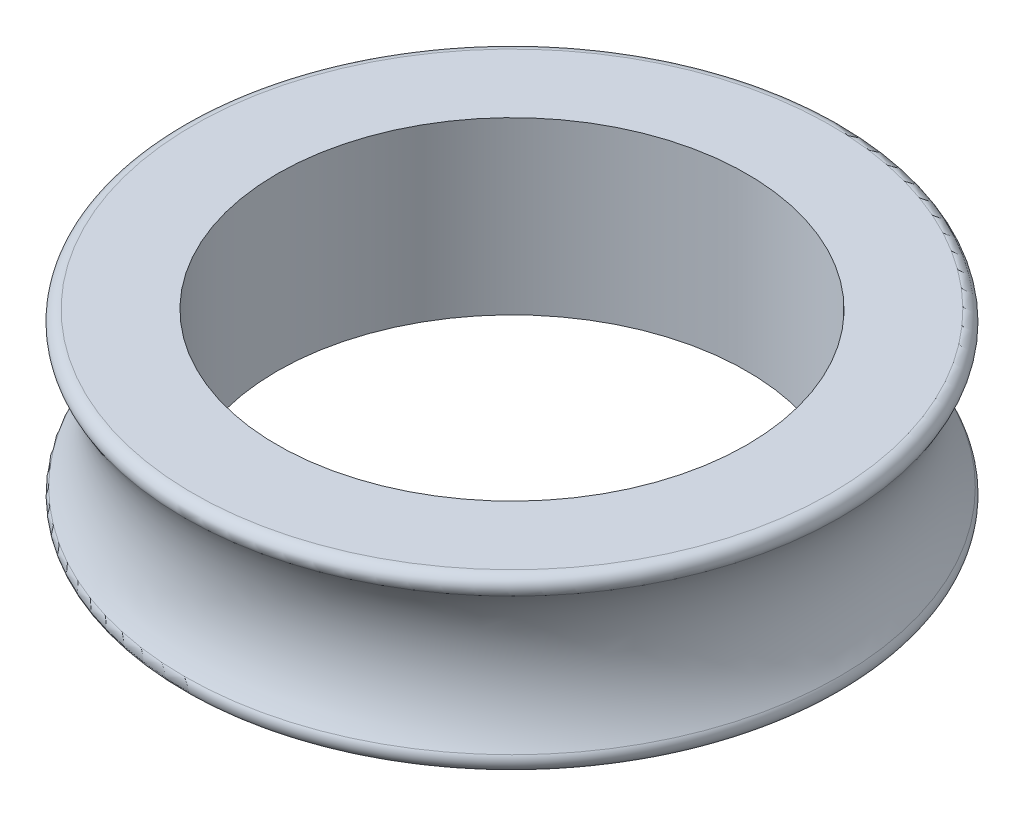
ISO-10303-21;
HEADER;
FILE_DESCRIPTION(('STEP AP214'),'2;1');
FILE_NAME('part.step','',(''),(''),'','','');
FILE_SCHEMA(('AUTOMOTIVE_DESIGN { 1 0 10303 214 1 1 1 1 }'));
ENDSEC;
DATA;
#1=APPLICATION_CONTEXT('core data for automotive mechanical design processes');
#2=APPLICATION_PROTOCOL_DEFINITION('international standard','automotive_design',2000,#1);
#3=PRODUCT_CONTEXT('',#1,'mechanical');
#4=PRODUCT('Part','Part','',(#3));
#5=PRODUCT_RELATED_PRODUCT_CATEGORY('part','',(#4));
#6=PRODUCT_DEFINITION_FORMATION('','',#4);
#7=PRODUCT_DEFINITION_CONTEXT('part definition',#1,'design');
#8=PRODUCT_DEFINITION('design','',#6,#7);
#9=PRODUCT_DEFINITION_SHAPE('','',#8);
#10=(LENGTH_UNIT() NAMED_UNIT(*) SI_UNIT(.MILLI.,.METRE.));
#11=(NAMED_UNIT(*) PLANE_ANGLE_UNIT() SI_UNIT($,.RADIAN.));
#12=(NAMED_UNIT(*) SI_UNIT($,.STERADIAN.) SOLID_ANGLE_UNIT());
#13=UNCERTAINTY_MEASURE_WITH_UNIT(LENGTH_MEASURE(1.E-05),#10,'distance_accuracy_value','');
#14=(GEOMETRIC_REPRESENTATION_CONTEXT(3) GLOBAL_UNCERTAINTY_ASSIGNED_CONTEXT((#13)) GLOBAL_UNIT_ASSIGNED_CONTEXT((#10,
#11,#12)) REPRESENTATION_CONTEXT('',''));
#15=CARTESIAN_POINT('',(0.,0.,0.));
#16=DIRECTION('',(0.,0.,1.));
#17=DIRECTION('',(1.,0.,0.));
#18=AXIS2_PLACEMENT_3D('',#15,#16,#17);
#19=CARTESIAN_POINT('',(0.,0.,0.));
#20=DIRECTION('',(0.,-1.,0.));
#21=DIRECTION('',(1.,0.,0.));
#22=AXIS2_PLACEMENT_3D('',#19,#20,#21);
#23=TOROIDAL_SURFACE('',#22,20.,5.65685424949239);
#24=CARTESIAN_POINT('',(0.,-3.21576393900432,0.));
#25=DIRECTION('',(0.,1.,0.));
#26=DIRECTION('',(-1.,0.,0.));
#27=AXIS2_PLACEMENT_3D('',#24,#25,#26);
#28=CIRCLE('',#27,15.3460917189313);
#29=CARTESIAN_POINT('',(-15.3460917189313,-3.21576393900437,0.));
#30=VERTEX_POINT('',#29);
#31=EDGE_CURVE('E45',#30,#30,#28,.T.);
#32=ORIENTED_EDGE('',*,*,#31,.T.);
#33=EDGE_LOOP('',(#32));
#34=FACE_BOUND('',#33,.T.);
#35=CARTESIAN_POINT('',(0.,3.2157639390044,0.));
#36=DIRECTION('',(0.,-1.,0.));
#37=DIRECTION('',(1.,0.,0.));
#38=AXIS2_PLACEMENT_3D('',#35,#36,#37);
#39=CIRCLE('',#38,15.3460917189314);
#40=CARTESIAN_POINT('',(15.3460917189314,3.21576393900445,0.));
#41=VERTEX_POINT('',#40);
#42=EDGE_CURVE('E50',#41,#41,#39,.T.);
#43=ORIENTED_EDGE('',*,*,#42,.T.);
#44=EDGE_LOOP('',(#43));
#45=FACE_BOUND('',#44,.T.);
#46=ADVANCED_FACE('F37',(#34,#45),#23,.F.);
#47=CARTESIAN_POINT('',(-16.,3.99999999999999,0.));
#48=DIRECTION('',(0.,-1.,0.));
#49=DIRECTION('',(1.,0.,0.));
#50=AXIS2_PLACEMENT_3D('',#47,#48,#49);
#51=PLANE('',#50);
#52=CARTESIAN_POINT('',(0.,4.00000000000005,0.));
#53=DIRECTION('',(0.,-1.,0.));
#54=DIRECTION('',(1.,0.,0.));
#55=AXIS2_PLACEMENT_3D('',#52,#53,#54);
#56=CIRCLE('',#55,14.9347404558609);
#57=CARTESIAN_POINT('',(14.9347404558609,4.0000000000001,0.));
#58=VERTEX_POINT('',#57);
#59=EDGE_CURVE('E10',#58,#58,#56,.F.);
#60=ORIENTED_EDGE('',*,*,#59,.T.);
#61=EDGE_LOOP('',(#60));
#62=FACE_BOUND('',#61,.T.);
#63=CARTESIAN_POINT('',(0.,4.,0.));
#64=DIRECTION('',(0.,-1.,0.));
#65=DIRECTION('',(1.,0.,0.));
#66=AXIS2_PLACEMENT_3D('',#63,#64,#65);
#67=CIRCLE('',#66,11.);
#68=CARTESIAN_POINT('',(11.,4.00000000000004,0.));
#69=VERTEX_POINT('',#68);
#70=EDGE_CURVE('E61',#69,#69,#67,.T.);
#71=ORIENTED_EDGE('',*,*,#70,.T.);
#72=EDGE_LOOP('',(#71));
#73=FACE_BOUND('',#72,.T.);
#74=ADVANCED_FACE('F82',(#62,#73),#51,.F.);
#75=CARTESIAN_POINT('',(3.43024899888577E-12,-1000.,0.));
#76=DIRECTION('',(0.,-1.,0.));
#77=DIRECTION('',(1.,0.,0.));
#78=AXIS2_PLACEMENT_3D('',#75,#76,#77);
#79=CYLINDRICAL_SURFACE('',#78,11.);
#80=ORIENTED_EDGE('',*,*,#70,.F.);
#81=EDGE_LOOP('',(#80));
#82=FACE_BOUND('',#81,.T.);
#83=CARTESIAN_POINT('',(0.,-4.,0.));
#84=DIRECTION('',(0.,-1.,0.));
#85=DIRECTION('',(1.,0.,0.));
#86=AXIS2_PLACEMENT_3D('',#83,#84,#85);
#87=CIRCLE('',#86,11.);
#88=CARTESIAN_POINT('',(11.,-3.99999999999997,0.));
#89=VERTEX_POINT('',#88);
#90=EDGE_CURVE('E65',#89,#89,#87,.T.);
#91=ORIENTED_EDGE('',*,*,#90,.T.);
#92=EDGE_LOOP('',(#91));
#93=FACE_BOUND('',#92,.T.);
#94=ADVANCED_FACE('F70',(#82,#93),#79,.F.);
#95=CARTESIAN_POINT('',(-11.,-3.99999999999999,0.));
#96=DIRECTION('',(0.,1.,0.));
#97=DIRECTION('',(-1.,0.,0.));
#98=AXIS2_PLACEMENT_3D('',#95,#96,#97);
#99=PLANE('',#98);
#100=CARTESIAN_POINT('',(0.,-3.99999999999996,0.));
#101=DIRECTION('',(0.,1.,0.));
#102=DIRECTION('',(-1.,0.,0.));
#103=AXIS2_PLACEMENT_3D('',#100,#101,#102);
#104=CIRCLE('',#103,14.9347404558609);
#105=CARTESIAN_POINT('',(-14.9347404558608,-4.00000000000001,0.));
#106=VERTEX_POINT('',#105);
#107=EDGE_CURVE('E55',#106,#106,#104,.F.);
#108=ORIENTED_EDGE('',*,*,#107,.T.);
#109=EDGE_LOOP('',(#108));
#110=FACE_BOUND('',#109,.T.);
#111=ORIENTED_EDGE('',*,*,#90,.F.);
#112=EDGE_LOOP('',(#111));
#113=FACE_BOUND('',#112,.T.);
#114=ADVANCED_FACE('F72',(#110,#113),#99,.F.);
#115=CARTESIAN_POINT('',(0.,-3.49999999999996,0.));
#116=DIRECTION('',(0.,-1.,0.));
#117=DIRECTION('',(1.,0.,0.));
#118=AXIS2_PLACEMENT_3D('',#115,#116,#117);
#119=TOROIDAL_SURFACE('',#118,14.9347404558609,0.5);
#120=ORIENTED_EDGE('',*,*,#31,.F.);
#121=EDGE_LOOP('',(#120));
#122=FACE_BOUND('',#121,.T.);
#123=ORIENTED_EDGE('',*,*,#107,.F.);
#124=EDGE_LOOP('',(#123));
#125=FACE_BOUND('',#124,.T.);
#126=ADVANCED_FACE('F74',(#122,#125),#119,.T.);
#127=CARTESIAN_POINT('',(0.,3.50000000000005,0.));
#128=DIRECTION('',(0.,1.,0.));
#129=DIRECTION('',(-1.,0.,0.));
#130=AXIS2_PLACEMENT_3D('',#127,#128,#129);
#131=TOROIDAL_SURFACE('',#130,14.9347404558609,0.5);
#132=ORIENTED_EDGE('',*,*,#59,.F.);
#133=EDGE_LOOP('',(#132));
#134=FACE_BOUND('',#133,.T.);
#135=ORIENTED_EDGE('',*,*,#42,.F.);
#136=EDGE_LOOP('',(#135));
#137=FACE_BOUND('',#136,.T.);
#138=ADVANCED_FACE('F39',(#134,#137),#131,.T.);
#139=CLOSED_SHELL('',(#46,#74,#94,#114,#126,#138));
#140=MANIFOLD_SOLID_BREP('B2',#139);
#141=ADVANCED_BREP_SHAPE_REPRESENTATION('',(#18,#140),#14);
#142=SHAPE_DEFINITION_REPRESENTATION(#9,#141);
ENDSEC;
END-ISO-10303-21;
